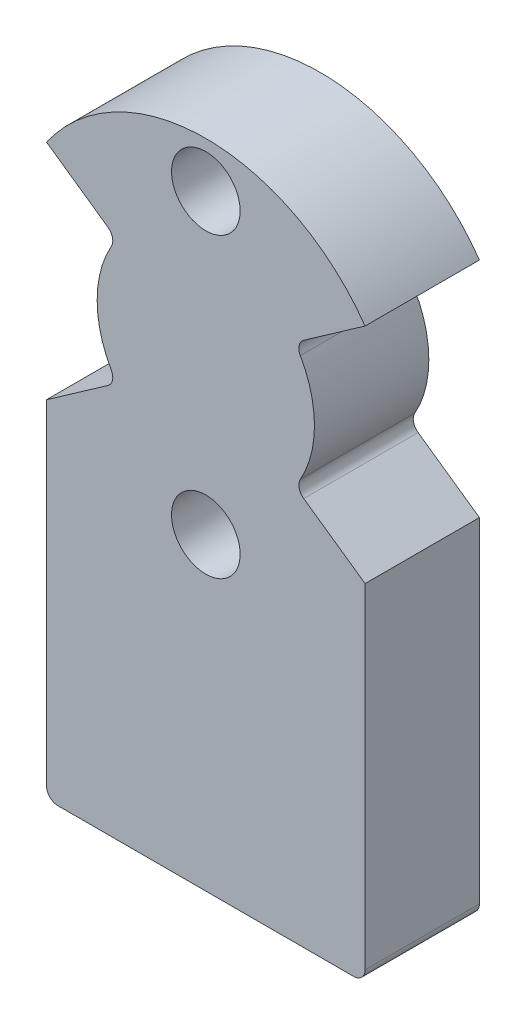
ISO-10303-21;
HEADER;
FILE_DESCRIPTION(('STEP AP214'),'2;1');
FILE_NAME('part.step','',(''),(''),'','','');
FILE_SCHEMA(('AUTOMOTIVE_DESIGN { 1 0 10303 214 1 1 1 1 }'));
ENDSEC;
DATA;
#1=APPLICATION_CONTEXT('core data for automotive mechanical design processes');
#2=APPLICATION_PROTOCOL_DEFINITION('international standard','automotive_design',2000,#1);
#3=PRODUCT_CONTEXT('',#1,'mechanical');
#4=PRODUCT('Part','Part','',(#3));
#5=PRODUCT_RELATED_PRODUCT_CATEGORY('part','',(#4));
#6=PRODUCT_DEFINITION_FORMATION('','',#4);
#7=PRODUCT_DEFINITION_CONTEXT('part definition',#1,'design');
#8=PRODUCT_DEFINITION('design','',#6,#7);
#9=PRODUCT_DEFINITION_SHAPE('','',#8);
#10=(LENGTH_UNIT() NAMED_UNIT(*) SI_UNIT(.MILLI.,.METRE.));
#11=(NAMED_UNIT(*) PLANE_ANGLE_UNIT() SI_UNIT($,.RADIAN.));
#12=(NAMED_UNIT(*) SI_UNIT($,.STERADIAN.) SOLID_ANGLE_UNIT());
#13=UNCERTAINTY_MEASURE_WITH_UNIT(LENGTH_MEASURE(1.E-05),#10,'distance_accuracy_value','');
#14=(GEOMETRIC_REPRESENTATION_CONTEXT(3) GLOBAL_UNCERTAINTY_ASSIGNED_CONTEXT((#13)) GLOBAL_UNIT_ASSIGNED_CONTEXT((#10,
#11,#12)) REPRESENTATION_CONTEXT('',''));
#15=CARTESIAN_POINT('',(0.,0.,0.));
#16=DIRECTION('',(0.,0.,1.));
#17=DIRECTION('',(1.,0.,0.));
#18=AXIS2_PLACEMENT_3D('',#15,#16,#17);
#19=CARTESIAN_POINT('',(0.,0.,5.));
#20=DIRECTION('',(0.,0.,1.));
#21=DIRECTION('',(1.,0.,0.));
#22=AXIS2_PLACEMENT_3D('',#19,#20,#21);
#23=PLANE('',#22);
#24=CARTESIAN_POINT('',(0.,6.5,5.));
#25=DIRECTION('',(0.,0.,1.));
#26=DIRECTION('',(1.,0.,0.));
#27=AXIS2_PLACEMENT_3D('',#24,#25,#26);
#28=CIRCLE('',#27,1.5);
#29=CARTESIAN_POINT('',(1.5,6.5,5.));
#30=VERTEX_POINT('',#29);
#31=EDGE_CURVE('E226',#30,#30,#28,.T.);
#32=ORIENTED_EDGE('',*,*,#31,.F.);
#33=EDGE_LOOP('',(#32));
#34=FACE_BOUND('',#33,.T.);
#35=CARTESIAN_POINT('',(0.,-6.5,5.));
#36=DIRECTION('',(0.,0.,1.));
#37=DIRECTION('',(1.,0.,0.));
#38=AXIS2_PLACEMENT_3D('',#35,#36,#37);
#39=CIRCLE('',#38,1.5);
#40=CARTESIAN_POINT('',(1.5,-6.5,5.));
#41=VERTEX_POINT('',#40);
#42=EDGE_CURVE('E221',#41,#41,#39,.T.);
#43=ORIENTED_EDGE('',*,*,#42,.F.);
#44=EDGE_LOOP('',(#43));
#45=FACE_BOUND('',#44,.T.);
#46=DIRECTION('',(-1.,0.,0.));
#47=VECTOR('',#46,1.);
#48=CARTESIAN_POINT('',(0.,-20.,5.));
#49=LINE('',#48,#47);
#50=CARTESIAN_POINT('',(6.46279237645642,-20.,5.));
#51=VERTEX_POINT('',#50);
#52=CARTESIAN_POINT('',(-6.46279237645642,-20.,5.));
#53=VERTEX_POINT('',#52);
#54=EDGE_CURVE('E192',#51,#53,#49,.T.);
#55=ORIENTED_EDGE('',*,*,#54,.F.);
#56=CARTESIAN_POINT('',(6.46279237645642,-19.5,5.));
#57=DIRECTION('',(0.,0.,1.));
#58=DIRECTION('',(1.,0.,0.));
#59=AXIS2_PLACEMENT_3D('',#56,#57,#58);
#60=CIRCLE('',#59,0.5);
#61=CARTESIAN_POINT('',(6.96279237645642,-19.5,5.));
#62=VERTEX_POINT('',#61);
#63=EDGE_CURVE('E48',#51,#62,#60,.T.);
#64=ORIENTED_EDGE('',*,*,#63,.T.);
#65=DIRECTION('',(0.,-1.,0.));
#66=VECTOR('',#65,1.);
#67=CARTESIAN_POINT('',(6.96279237645642,0.,5.));
#68=LINE('',#67,#66);
#69=CARTESIAN_POINT('',(6.96279237645642,-4.8753997089839,5.));
#70=VERTEX_POINT('',#69);
#71=EDGE_CURVE('E285',#70,#62,#68,.T.);
#72=ORIENTED_EDGE('',*,*,#71,.F.);
#73=DIRECTION('',(0.819152044288991,-0.573576436351047,0.));
#74=VECTOR('',#73,1.);
#75=CARTESIAN_POINT('',(0.,0.,5.));
#76=LINE('',#75,#74);
#77=CARTESIAN_POINT('',(4.28100018480391,-2.99758860047687,5.));
#78=VERTEX_POINT('',#77);
#79=EDGE_CURVE('E170',#78,#70,#76,.T.);
#80=ORIENTED_EDGE('',*,*,#79,.F.);
#81=CARTESIAN_POINT('',(4.56778840297943,-2.58801257833237,5.));
#82=DIRECTION('',(0.,0.,1.));
#83=DIRECTION('',(1.,0.,0.));
#84=AXIS2_PLACEMENT_3D('',#81,#82,#83);
#85=CIRCLE('',#84,0.5);
#86=CARTESIAN_POINT('',(4.13276093602901,-2.34153518991977,5.));
#87=VERTEX_POINT('',#86);
#88=EDGE_CURVE('E272',#78,#87,#85,.F.);
#89=ORIENTED_EDGE('',*,*,#88,.T.);
#90=CARTESIAN_POINT('',(0.,0.,5.));
#91=DIRECTION('',(0.,0.,1.));
#92=DIRECTION('',(1.,0.,0.));
#93=AXIS2_PLACEMENT_3D('',#90,#91,#92);
#94=CIRCLE('',#93,4.75);
#95=CARTESIAN_POINT('',(4.13276093602901,2.34153518991977,5.));
#96=VERTEX_POINT('',#95);
#97=EDGE_CURVE('E163',#87,#96,#94,.T.);
#98=ORIENTED_EDGE('',*,*,#97,.T.);
#99=CARTESIAN_POINT('',(4.56778840297943,2.58801257833237,5.));
#100=DIRECTION('',(0.,0.,1.));
#101=DIRECTION('',(1.,0.,0.));
#102=AXIS2_PLACEMENT_3D('',#99,#100,#101);
#103=CIRCLE('',#102,0.5);
#104=CARTESIAN_POINT('',(4.28100018480391,2.99758860047687,5.));
#105=VERTEX_POINT('',#104);
#106=EDGE_CURVE('E269',#96,#105,#103,.F.);
#107=ORIENTED_EDGE('',*,*,#106,.T.);
#108=DIRECTION('',(0.819152044288991,0.573576436351047,0.));
#109=VECTOR('',#108,1.);
#110=CARTESIAN_POINT('',(0.,0.,5.));
#111=LINE('',#110,#109);
#112=CARTESIAN_POINT('',(6.96279237645642,4.8753997089839,5.));
#113=VERTEX_POINT('',#112);
#114=EDGE_CURVE('E195',#105,#113,#111,.T.);
#115=ORIENTED_EDGE('',*,*,#114,.T.);
#116=CARTESIAN_POINT('',(0.,0.,5.));
#117=DIRECTION('',(0.,0.,1.));
#118=DIRECTION('',(1.,0.,0.));
#119=AXIS2_PLACEMENT_3D('',#116,#117,#118);
#120=CIRCLE('',#119,8.5);
#121=CARTESIAN_POINT('',(-6.96279237645642,4.8753997089839,5.));
#122=VERTEX_POINT('',#121);
#123=EDGE_CURVE('E234',#113,#122,#120,.T.);
#124=ORIENTED_EDGE('',*,*,#123,.T.);
#125=DIRECTION('',(-0.819152044288991,0.573576436351047,0.));
#126=VECTOR('',#125,1.);
#127=CARTESIAN_POINT('',(0.,0.,5.));
#128=LINE('',#127,#126);
#129=CARTESIAN_POINT('',(-4.28100018480391,2.99758860047687,5.));
#130=VERTEX_POINT('',#129);
#131=EDGE_CURVE('E211',#130,#122,#128,.T.);
#132=ORIENTED_EDGE('',*,*,#131,.F.);
#133=CARTESIAN_POINT('',(-4.56778840297943,2.58801257833237,5.));
#134=DIRECTION('',(0.,0.,1.));
#135=DIRECTION('',(1.,0.,0.));
#136=AXIS2_PLACEMENT_3D('',#133,#134,#135);
#137=CIRCLE('',#136,0.5);
#138=CARTESIAN_POINT('',(-4.13276093602901,2.34153518991977,5.));
#139=VERTEX_POINT('',#138);
#140=EDGE_CURVE('E265',#130,#139,#137,.F.);
#141=ORIENTED_EDGE('',*,*,#140,.T.);
#142=CARTESIAN_POINT('',(0.,0.,5.));
#143=DIRECTION('',(0.,0.,-1.));
#144=DIRECTION('',(-1.,0.,0.));
#145=AXIS2_PLACEMENT_3D('',#142,#143,#144);
#146=CIRCLE('',#145,4.75);
#147=CARTESIAN_POINT('',(-4.13276093602901,-2.34153518991977,5.));
#148=VERTEX_POINT('',#147);
#149=EDGE_CURVE('E205',#148,#139,#146,.T.);
#150=ORIENTED_EDGE('',*,*,#149,.F.);
#151=CARTESIAN_POINT('',(-4.56778840297943,-2.58801257833237,5.));
#152=DIRECTION('',(0.,0.,1.));
#153=DIRECTION('',(1.,0.,0.));
#154=AXIS2_PLACEMENT_3D('',#151,#152,#153);
#155=CIRCLE('',#154,0.5);
#156=CARTESIAN_POINT('',(-4.28100018480391,-2.99758860047687,5.));
#157=VERTEX_POINT('',#156);
#158=EDGE_CURVE('E261',#148,#157,#155,.F.);
#159=ORIENTED_EDGE('',*,*,#158,.T.);
#160=DIRECTION('',(-0.819152044288991,-0.573576436351047,0.));
#161=VECTOR('',#160,1.);
#162=CARTESIAN_POINT('',(0.,0.,5.));
#163=LINE('',#162,#161);
#164=CARTESIAN_POINT('',(-6.96279237645642,-4.8753997089839,5.));
#165=VERTEX_POINT('',#164);
#166=EDGE_CURVE('E208',#157,#165,#163,.T.);
#167=ORIENTED_EDGE('',*,*,#166,.T.);
#168=DIRECTION('',(0.,-1.,0.));
#169=VECTOR('',#168,1.);
#170=CARTESIAN_POINT('',(-6.96279237645642,0.,5.));
#171=LINE('',#170,#169);
#172=CARTESIAN_POINT('',(-6.96279237645642,-19.5,5.));
#173=VERTEX_POINT('',#172);
#174=EDGE_CURVE('E185',#165,#173,#171,.T.);
#175=ORIENTED_EDGE('',*,*,#174,.T.);
#176=CARTESIAN_POINT('',(-6.46279237645642,-19.5,5.));
#177=DIRECTION('',(0.,0.,1.));
#178=DIRECTION('',(1.,0.,0.));
#179=AXIS2_PLACEMENT_3D('',#176,#177,#178);
#180=CIRCLE('',#179,0.5);
#181=EDGE_CURVE('E60',#173,#53,#180,.T.);
#182=ORIENTED_EDGE('',*,*,#181,.T.);
#183=EDGE_LOOP('',(#55,#64,#72,#80,#89,#98,#107,#115,#124,#132,#141,#150,#159,#167,#175,#182));
#184=FACE_BOUND('',#183,.T.);
#185=ADVANCED_FACE('F40',(#34,#45,#184),#23,.T.);
#186=CARTESIAN_POINT('',(0.,0.,0.));
#187=DIRECTION('',(0.,0.,1.));
#188=DIRECTION('',(1.,0.,0.));
#189=AXIS2_PLACEMENT_3D('',#186,#187,#188);
#190=PLANE('',#189);
#191=CARTESIAN_POINT('',(0.,6.5,0.));
#192=DIRECTION('',(0.,0.,1.));
#193=DIRECTION('',(1.,0.,0.));
#194=AXIS2_PLACEMENT_3D('',#191,#192,#193);
#195=CIRCLE('',#194,1.5);
#196=CARTESIAN_POINT('',(1.5,6.5,0.));
#197=VERTEX_POINT('',#196);
#198=EDGE_CURVE('E222',#197,#197,#195,.T.);
#199=ORIENTED_EDGE('',*,*,#198,.T.);
#200=EDGE_LOOP('',(#199));
#201=FACE_BOUND('',#200,.T.);
#202=CARTESIAN_POINT('',(0.,-6.5,0.));
#203=DIRECTION('',(0.,0.,1.));
#204=DIRECTION('',(1.,0.,0.));
#205=AXIS2_PLACEMENT_3D('',#202,#203,#204);
#206=CIRCLE('',#205,1.5);
#207=CARTESIAN_POINT('',(1.5,-6.5,0.));
#208=VERTEX_POINT('',#207);
#209=EDGE_CURVE('E229',#208,#208,#206,.T.);
#210=ORIENTED_EDGE('',*,*,#209,.T.);
#211=EDGE_LOOP('',(#210));
#212=FACE_BOUND('',#211,.T.);
#213=DIRECTION('',(0.,-1.,0.));
#214=VECTOR('',#213,1.);
#215=CARTESIAN_POINT('',(6.96279237645642,0.,0.));
#216=LINE('',#215,#214);
#217=CARTESIAN_POINT('',(6.96279237645643,-4.8753997089839,0.));
#218=VERTEX_POINT('',#217);
#219=CARTESIAN_POINT('',(6.96279237645642,-19.5,0.));
#220=VERTEX_POINT('',#219);
#221=EDGE_CURVE('E158',#218,#220,#216,.T.);
#222=ORIENTED_EDGE('',*,*,#221,.T.);
#223=CARTESIAN_POINT('',(6.46279237645642,-19.5,0.));
#224=DIRECTION('',(0.,0.,1.));
#225=DIRECTION('',(1.,0.,0.));
#226=AXIS2_PLACEMENT_3D('',#223,#224,#225);
#227=CIRCLE('',#226,0.5);
#228=CARTESIAN_POINT('',(6.46279237645642,-20.,0.));
#229=VERTEX_POINT('',#228);
#230=EDGE_CURVE('E277',#220,#229,#227,.F.);
#231=ORIENTED_EDGE('',*,*,#230,.T.);
#232=DIRECTION('',(-1.,0.,0.));
#233=VECTOR('',#232,1.);
#234=CARTESIAN_POINT('',(0.,-20.,0.));
#235=LINE('',#234,#233);
#236=CARTESIAN_POINT('',(-6.46279237645642,-20.,0.));
#237=VERTEX_POINT('',#236);
#238=EDGE_CURVE('E181',#229,#237,#235,.T.);
#239=ORIENTED_EDGE('',*,*,#238,.T.);
#240=CARTESIAN_POINT('',(-6.46279237645642,-19.5,0.));
#241=DIRECTION('',(0.,0.,1.));
#242=DIRECTION('',(1.,0.,0.));
#243=AXIS2_PLACEMENT_3D('',#240,#241,#242);
#244=CIRCLE('',#243,0.5);
#245=CARTESIAN_POINT('',(-6.96279237645642,-19.5,0.));
#246=VERTEX_POINT('',#245);
#247=EDGE_CURVE('E275',#237,#246,#244,.F.);
#248=ORIENTED_EDGE('',*,*,#247,.T.);
#249=DIRECTION('',(0.,-1.,0.));
#250=VECTOR('',#249,1.);
#251=CARTESIAN_POINT('',(-6.96279237645642,0.,0.));
#252=LINE('',#251,#250);
#253=CARTESIAN_POINT('',(-6.96279237645642,-4.8753997089839,0.));
#254=VERTEX_POINT('',#253);
#255=EDGE_CURVE('E182',#254,#246,#252,.T.);
#256=ORIENTED_EDGE('',*,*,#255,.F.);
#257=DIRECTION('',(-0.819152044288991,-0.573576436351047,0.));
#258=VECTOR('',#257,1.);
#259=CARTESIAN_POINT('',(0.,0.,0.));
#260=LINE('',#259,#258);
#261=CARTESIAN_POINT('',(-4.28100018480391,-2.99758860047687,0.));
#262=VERTEX_POINT('',#261);
#263=EDGE_CURVE('E216',#262,#254,#260,.T.);
#264=ORIENTED_EDGE('',*,*,#263,.F.);
#265=CARTESIAN_POINT('',(-4.56778840297943,-2.58801257833237,0.));
#266=DIRECTION('',(0.,0.,1.));
#267=DIRECTION('',(1.,0.,0.));
#268=AXIS2_PLACEMENT_3D('',#265,#266,#267);
#269=CIRCLE('',#268,0.5);
#270=CARTESIAN_POINT('',(-4.13276093602901,-2.34153518991977,0.));
#271=VERTEX_POINT('',#270);
#272=EDGE_CURVE('E259',#262,#271,#269,.T.);
#273=ORIENTED_EDGE('',*,*,#272,.T.);
#274=CARTESIAN_POINT('',(0.,0.,0.));
#275=DIRECTION('',(0.,0.,-1.));
#276=DIRECTION('',(-1.,0.,0.));
#277=AXIS2_PLACEMENT_3D('',#274,#275,#276);
#278=CIRCLE('',#277,4.75);
#279=CARTESIAN_POINT('',(-4.13276093602901,2.34153518991977,0.));
#280=VERTEX_POINT('',#279);
#281=EDGE_CURVE('E204',#271,#280,#278,.T.);
#282=ORIENTED_EDGE('',*,*,#281,.T.);
#283=CARTESIAN_POINT('',(-4.56778840297943,2.58801257833237,0.));
#284=DIRECTION('',(0.,0.,1.));
#285=DIRECTION('',(1.,0.,0.));
#286=AXIS2_PLACEMENT_3D('',#283,#284,#285);
#287=CIRCLE('',#286,0.5);
#288=CARTESIAN_POINT('',(-4.28100018480391,2.99758860047687,0.));
#289=VERTEX_POINT('',#288);
#290=EDGE_CURVE('E263',#280,#289,#287,.T.);
#291=ORIENTED_EDGE('',*,*,#290,.T.);
#292=DIRECTION('',(-0.819152044288991,0.573576436351047,0.));
#293=VECTOR('',#292,1.);
#294=CARTESIAN_POINT('',(0.,0.,0.));
#295=LINE('',#294,#293);
#296=CARTESIAN_POINT('',(-6.96279237645642,4.8753997089839,0.));
#297=VERTEX_POINT('',#296);
#298=EDGE_CURVE('E209',#289,#297,#295,.T.);
#299=ORIENTED_EDGE('',*,*,#298,.T.);
#300=CARTESIAN_POINT('',(0.,0.,0.));
#301=DIRECTION('',(0.,0.,1.));
#302=DIRECTION('',(1.,0.,0.));
#303=AXIS2_PLACEMENT_3D('',#300,#301,#302);
#304=CIRCLE('',#303,8.5);
#305=CARTESIAN_POINT('',(6.96279237645642,4.8753997089839,0.));
#306=VERTEX_POINT('',#305);
#307=EDGE_CURVE('E225',#306,#297,#304,.T.);
#308=ORIENTED_EDGE('',*,*,#307,.F.);
#309=DIRECTION('',(0.819152044288991,0.573576436351047,0.));
#310=VECTOR('',#309,1.);
#311=CARTESIAN_POINT('',(0.,0.,0.));
#312=LINE('',#311,#310);
#313=CARTESIAN_POINT('',(4.28100018480391,2.99758860047687,0.));
#314=VERTEX_POINT('',#313);
#315=EDGE_CURVE('E164',#314,#306,#312,.T.);
#316=ORIENTED_EDGE('',*,*,#315,.F.);
#317=CARTESIAN_POINT('',(4.56778840297943,2.58801257833237,0.));
#318=DIRECTION('',(0.,0.,1.));
#319=DIRECTION('',(1.,0.,0.));
#320=AXIS2_PLACEMENT_3D('',#317,#318,#319);
#321=CIRCLE('',#320,0.5);
#322=CARTESIAN_POINT('',(4.13276093602901,2.34153518991977,0.));
#323=VERTEX_POINT('',#322);
#324=EDGE_CURVE('E267',#314,#323,#321,.T.);
#325=ORIENTED_EDGE('',*,*,#324,.T.);
#326=CARTESIAN_POINT('',(0.,0.,0.));
#327=DIRECTION('',(0.,0.,1.));
#328=DIRECTION('',(1.,0.,0.));
#329=AXIS2_PLACEMENT_3D('',#326,#327,#328);
#330=CIRCLE('',#329,4.75);
#331=CARTESIAN_POINT('',(4.13276093602901,-2.34153518991977,0.));
#332=VERTEX_POINT('',#331);
#333=EDGE_CURVE('E174',#332,#323,#330,.T.);
#334=ORIENTED_EDGE('',*,*,#333,.F.);
#335=CARTESIAN_POINT('',(4.56778840297943,-2.58801257833237,0.));
#336=DIRECTION('',(0.,0.,1.));
#337=DIRECTION('',(1.,0.,0.));
#338=AXIS2_PLACEMENT_3D('',#335,#336,#337);
#339=CIRCLE('',#338,0.5);
#340=CARTESIAN_POINT('',(4.28100018480391,-2.99758860047687,0.));
#341=VERTEX_POINT('',#340);
#342=EDGE_CURVE('E160',#332,#341,#339,.T.);
#343=ORIENTED_EDGE('',*,*,#342,.T.);
#344=DIRECTION('',(0.819152044288991,-0.573576436351047,0.));
#345=VECTOR('',#344,1.);
#346=CARTESIAN_POINT('',(0.,0.,0.));
#347=LINE('',#346,#345);
#348=EDGE_CURVE('E154',#341,#218,#347,.T.);
#349=ORIENTED_EDGE('',*,*,#348,.T.);
#350=EDGE_LOOP('',(#222,#231,#239,#248,#256,#264,#273,#282,#291,#299,#308,#316,#325,#334,#343,#349));
#351=FACE_BOUND('',#350,.T.);
#352=ADVANCED_FACE('F156',(#201,#212,#351),#190,.F.);
#353=CARTESIAN_POINT('',(0.,0.,5.));
#354=DIRECTION('',(0.,0.,-1.));
#355=DIRECTION('',(-1.,0.,0.));
#356=AXIS2_PLACEMENT_3D('',#353,#354,#355);
#357=CYLINDRICAL_SURFACE('',#356,8.5);
#358=ORIENTED_EDGE('',*,*,#123,.F.);
#359=DIRECTION('',(0.,0.,-1.));
#360=VECTOR('',#359,1.);
#361=CARTESIAN_POINT('',(6.96279237645642,4.8753997089839,5.));
#362=LINE('',#361,#360);
#363=EDGE_CURVE('E198',#113,#306,#362,.T.);
#364=ORIENTED_EDGE('',*,*,#363,.T.);
#365=ORIENTED_EDGE('',*,*,#307,.T.);
#366=DIRECTION('',(0.,0.,-1.));
#367=VECTOR('',#366,1.);
#368=CARTESIAN_POINT('',(-6.96279237645642,4.8753997089839,5.));
#369=LINE('',#368,#367);
#370=EDGE_CURVE('E213',#122,#297,#369,.T.);
#371=ORIENTED_EDGE('',*,*,#370,.F.);
#372=EDGE_LOOP('',(#358,#364,#365,#371));
#373=FACE_BOUND('',#372,.T.);
#374=ADVANCED_FACE('F324',(#373),#357,.T.);
#375=CARTESIAN_POINT('',(0.,-6.5,0.));
#376=DIRECTION('',(0.,0.,1.));
#377=DIRECTION('',(1.,0.,0.));
#378=AXIS2_PLACEMENT_3D('',#375,#376,#377);
#379=CYLINDRICAL_SURFACE('',#378,1.5);
#380=ORIENTED_EDGE('',*,*,#209,.F.);
#381=EDGE_LOOP('',(#380));
#382=FACE_BOUND('',#381,.T.);
#383=ORIENTED_EDGE('',*,*,#42,.T.);
#384=EDGE_LOOP('',(#383));
#385=FACE_BOUND('',#384,.T.);
#386=ADVANCED_FACE('F360',(#382,#385),#379,.F.);
#387=CARTESIAN_POINT('',(0.,6.5,0.));
#388=DIRECTION('',(0.,0.,1.));
#389=DIRECTION('',(1.,0.,0.));
#390=AXIS2_PLACEMENT_3D('',#387,#388,#389);
#391=CYLINDRICAL_SURFACE('',#390,1.5);
#392=ORIENTED_EDGE('',*,*,#198,.F.);
#393=EDGE_LOOP('',(#392));
#394=FACE_BOUND('',#393,.T.);
#395=ORIENTED_EDGE('',*,*,#31,.T.);
#396=EDGE_LOOP('',(#395));
#397=FACE_BOUND('',#396,.T.);
#398=ADVANCED_FACE('F496',(#394,#397),#391,.F.);
#399=CARTESIAN_POINT('',(0.,0.,5.));
#400=DIRECTION('',(0.,0.,-1.));
#401=DIRECTION('',(-1.,0.,0.));
#402=AXIS2_PLACEMENT_3D('',#399,#400,#401);
#403=CYLINDRICAL_SURFACE('',#402,4.75);
#404=ORIENTED_EDGE('',*,*,#281,.F.);
#405=DIRECTION('',(0.,0.,-1.));
#406=VECTOR('',#405,1.);
#407=CARTESIAN_POINT('',(-4.13276093602901,-2.34153518991977,5.));
#408=LINE('',#407,#406);
#409=EDGE_CURVE('E245',#271,#148,#408,.F.);
#410=ORIENTED_EDGE('',*,*,#409,.T.);
#411=ORIENTED_EDGE('',*,*,#149,.T.);
#412=DIRECTION('',(0.,0.,-1.));
#413=VECTOR('',#412,1.);
#414=CARTESIAN_POINT('',(-4.13276093602901,2.34153518991977,5.));
#415=LINE('',#414,#413);
#416=EDGE_CURVE('E242',#139,#280,#415,.T.);
#417=ORIENTED_EDGE('',*,*,#416,.T.);
#418=EDGE_LOOP('',(#404,#410,#411,#417));
#419=FACE_BOUND('',#418,.T.);
#420=ADVANCED_FACE('F307',(#419),#403,.T.);
#421=CARTESIAN_POINT('',(0.,0.,5.));
#422=DIRECTION('',(-0.573576436351047,-0.819152044288991,0.));
#423=DIRECTION('',(0.819152044288991,-0.573576436351047,0.));
#424=AXIS2_PLACEMENT_3D('',#421,#422,#423);
#425=PLANE('',#424);
#426=ORIENTED_EDGE('',*,*,#298,.F.);
#427=DIRECTION('',(0.,0.,1.));
#428=VECTOR('',#427,1.);
#429=CARTESIAN_POINT('',(-4.28100018480391,2.99758860047687,5.));
#430=LINE('',#429,#428);
#431=EDGE_CURVE('E247',#289,#130,#430,.T.);
#432=ORIENTED_EDGE('',*,*,#431,.T.);
#433=ORIENTED_EDGE('',*,*,#131,.T.);
#434=ORIENTED_EDGE('',*,*,#370,.T.);
#435=EDGE_LOOP('',(#426,#432,#433,#434));
#436=FACE_BOUND('',#435,.T.);
#437=ADVANCED_FACE('F320',(#436),#425,.T.);
#438=CARTESIAN_POINT('',(0.,0.,5.));
#439=DIRECTION('',(0.573576436351047,-0.819152044288991,0.));
#440=DIRECTION('',(0.819152044288991,0.573576436351047,0.));
#441=AXIS2_PLACEMENT_3D('',#438,#439,#440);
#442=PLANE('',#441);
#443=ORIENTED_EDGE('',*,*,#166,.F.);
#444=DIRECTION('',(0.,0.,-1.));
#445=VECTOR('',#444,1.);
#446=CARTESIAN_POINT('',(-4.28100018480391,-2.99758860047687,5.));
#447=LINE('',#446,#445);
#448=EDGE_CURVE('E237',#157,#262,#447,.T.);
#449=ORIENTED_EDGE('',*,*,#448,.T.);
#450=ORIENTED_EDGE('',*,*,#263,.T.);
#451=DIRECTION('',(0.,0.,-1.));
#452=VECTOR('',#451,1.);
#453=CARTESIAN_POINT('',(-6.96279237645642,-4.8753997089839,5.));
#454=LINE('',#453,#452);
#455=EDGE_CURVE('E175',#165,#254,#454,.T.);
#456=ORIENTED_EDGE('',*,*,#455,.F.);
#457=EDGE_LOOP('',(#443,#449,#450,#456));
#458=FACE_BOUND('',#457,.T.);
#459=ADVANCED_FACE('F301',(#458),#442,.F.);
#460=CARTESIAN_POINT('',(0.,0.,5.));
#461=DIRECTION('',(0.,0.,-1.));
#462=DIRECTION('',(-1.,0.,0.));
#463=AXIS2_PLACEMENT_3D('',#460,#461,#462);
#464=CYLINDRICAL_SURFACE('',#463,4.75);
#465=ORIENTED_EDGE('',*,*,#333,.T.);
#466=DIRECTION('',(0.,0.,-1.));
#467=VECTOR('',#466,1.);
#468=CARTESIAN_POINT('',(4.13276093602901,2.34153518991977,5.));
#469=LINE('',#468,#467);
#470=EDGE_CURVE('E255',#323,#96,#469,.F.);
#471=ORIENTED_EDGE('',*,*,#470,.T.);
#472=ORIENTED_EDGE('',*,*,#97,.F.);
#473=DIRECTION('',(0.,0.,-1.));
#474=VECTOR('',#473,1.);
#475=CARTESIAN_POINT('',(4.13276093602901,-2.34153518991977,5.));
#476=LINE('',#475,#474);
#477=EDGE_CURVE('E252',#87,#332,#476,.T.);
#478=ORIENTED_EDGE('',*,*,#477,.T.);
#479=EDGE_LOOP('',(#465,#471,#472,#478));
#480=FACE_BOUND('',#479,.T.);
#481=ADVANCED_FACE('F337',(#480),#464,.T.);
#482=CARTESIAN_POINT('',(0.,0.,5.));
#483=DIRECTION('',(0.573576436351047,0.819152044288991,0.));
#484=DIRECTION('',(-0.819152044288991,0.573576436351047,0.));
#485=AXIS2_PLACEMENT_3D('',#482,#483,#484);
#486=PLANE('',#485);
#487=ORIENTED_EDGE('',*,*,#348,.F.);
#488=DIRECTION('',(0.,0.,-1.));
#489=VECTOR('',#488,1.);
#490=CARTESIAN_POINT('',(4.28100018480391,-2.99758860047687,5.));
#491=LINE('',#490,#489);
#492=EDGE_CURVE('E257',#341,#78,#491,.F.);
#493=ORIENTED_EDGE('',*,*,#492,.T.);
#494=ORIENTED_EDGE('',*,*,#79,.T.);
#495=DIRECTION('',(0.,0.,-1.));
#496=VECTOR('',#495,1.);
#497=CARTESIAN_POINT('',(6.96279237645643,-4.8753997089839,5.));
#498=LINE('',#497,#496);
#499=EDGE_CURVE('E167',#70,#218,#498,.T.);
#500=ORIENTED_EDGE('',*,*,#499,.T.);
#501=EDGE_LOOP('',(#487,#493,#494,#500));
#502=FACE_BOUND('',#501,.T.);
#503=ADVANCED_FACE('F168',(#502),#486,.T.);
#504=CARTESIAN_POINT('',(0.,0.,5.));
#505=DIRECTION('',(-0.573576436351047,0.819152044288991,0.));
#506=DIRECTION('',(-0.819152044288991,-0.573576436351047,0.));
#507=AXIS2_PLACEMENT_3D('',#504,#505,#506);
#508=PLANE('',#507);
#509=ORIENTED_EDGE('',*,*,#114,.F.);
#510=DIRECTION('',(0.,0.,1.));
#511=VECTOR('',#510,1.);
#512=CARTESIAN_POINT('',(4.28100018480391,2.99758860047687,0.));
#513=LINE('',#512,#511);
#514=EDGE_CURVE('E249',#105,#314,#513,.F.);
#515=ORIENTED_EDGE('',*,*,#514,.T.);
#516=ORIENTED_EDGE('',*,*,#315,.T.);
#517=ORIENTED_EDGE('',*,*,#363,.F.);
#518=EDGE_LOOP('',(#509,#515,#516,#517));
#519=FACE_BOUND('',#518,.T.);
#520=ADVANCED_FACE('F329',(#519),#508,.F.);
#521=CARTESIAN_POINT('',(-6.96279237645642,0.,5.));
#522=DIRECTION('',(1.,0.,0.));
#523=DIRECTION('',(0.,0.,-1.));
#524=AXIS2_PLACEMENT_3D('',#521,#522,#523);
#525=PLANE('',#524);
#526=ORIENTED_EDGE('',*,*,#255,.T.);
#527=DIRECTION('',(0.,0.,-1.));
#528=VECTOR('',#527,1.);
#529=CARTESIAN_POINT('',(-6.96279237645642,-19.5,5.));
#530=LINE('',#529,#528);
#531=EDGE_CURVE('E11',#246,#173,#530,.F.);
#532=ORIENTED_EDGE('',*,*,#531,.T.);
#533=ORIENTED_EDGE('',*,*,#174,.F.);
#534=ORIENTED_EDGE('',*,*,#455,.T.);
#535=EDGE_LOOP('',(#526,#532,#533,#534));
#536=FACE_BOUND('',#535,.T.);
#537=ADVANCED_FACE('F297',(#536),#525,.F.);
#538=CARTESIAN_POINT('',(0.,-20.,5.));
#539=DIRECTION('',(0.,-1.,0.));
#540=DIRECTION('',(0.,0.,-1.));
#541=AXIS2_PLACEMENT_3D('',#538,#539,#540);
#542=PLANE('',#541);
#543=ORIENTED_EDGE('',*,*,#238,.F.);
#544=DIRECTION('',(0.,0.,-1.));
#545=VECTOR('',#544,1.);
#546=CARTESIAN_POINT('',(6.46279237645642,-20.,5.));
#547=LINE('',#546,#545);
#548=EDGE_CURVE('E282',#229,#51,#547,.F.);
#549=ORIENTED_EDGE('',*,*,#548,.T.);
#550=ORIENTED_EDGE('',*,*,#54,.T.);
#551=DIRECTION('',(0.,0.,-1.));
#552=VECTOR('',#551,1.);
#553=CARTESIAN_POINT('',(-6.46279237645642,-20.,0.));
#554=LINE('',#553,#552);
#555=EDGE_CURVE('E279',#53,#237,#554,.T.);
#556=ORIENTED_EDGE('',*,*,#555,.T.);
#557=EDGE_LOOP('',(#543,#549,#550,#556));
#558=FACE_BOUND('',#557,.T.);
#559=ADVANCED_FACE('F292',(#558),#542,.T.);
#560=CARTESIAN_POINT('',(6.96279237645642,0.,5.));
#561=DIRECTION('',(1.,0.,0.));
#562=DIRECTION('',(0.,0.,-1.));
#563=AXIS2_PLACEMENT_3D('',#560,#561,#562);
#564=PLANE('',#563);
#565=ORIENTED_EDGE('',*,*,#71,.T.);
#566=DIRECTION('',(0.,0.,-1.));
#567=VECTOR('',#566,1.);
#568=CARTESIAN_POINT('',(6.96279237645642,-19.5,5.));
#569=LINE('',#568,#567);
#570=EDGE_CURVE('E180',#62,#220,#569,.T.);
#571=ORIENTED_EDGE('',*,*,#570,.T.);
#572=ORIENTED_EDGE('',*,*,#221,.F.);
#573=ORIENTED_EDGE('',*,*,#499,.F.);
#574=EDGE_LOOP('',(#565,#571,#572,#573));
#575=FACE_BOUND('',#574,.T.);
#576=ADVANCED_FACE('F178',(#575),#564,.T.);
#577=CARTESIAN_POINT('',(-4.56778840297943,-2.58801257833237,5.));
#578=DIRECTION('',(0.,0.,-1.));
#579=DIRECTION('',(-1.,0.,0.));
#580=AXIS2_PLACEMENT_3D('',#577,#578,#579);
#581=CYLINDRICAL_SURFACE('',#580,0.5);
#582=ORIENTED_EDGE('',*,*,#158,.F.);
#583=ORIENTED_EDGE('',*,*,#409,.F.);
#584=ORIENTED_EDGE('',*,*,#272,.F.);
#585=ORIENTED_EDGE('',*,*,#448,.F.);
#586=EDGE_LOOP('',(#582,#583,#584,#585));
#587=FACE_BOUND('',#586,.T.);
#588=ADVANCED_FACE('F311',(#587),#581,.F.);
#589=CARTESIAN_POINT('',(-4.56778840297943,2.58801257833237,5.));
#590=DIRECTION('',(0.,0.,-1.));
#591=DIRECTION('',(-1.,0.,0.));
#592=AXIS2_PLACEMENT_3D('',#589,#590,#591);
#593=CYLINDRICAL_SURFACE('',#592,0.5);
#594=ORIENTED_EDGE('',*,*,#140,.F.);
#595=ORIENTED_EDGE('',*,*,#431,.F.);
#596=ORIENTED_EDGE('',*,*,#290,.F.);
#597=ORIENTED_EDGE('',*,*,#416,.F.);
#598=EDGE_LOOP('',(#594,#595,#596,#597));
#599=FACE_BOUND('',#598,.T.);
#600=ADVANCED_FACE('F315',(#599),#593,.F.);
#601=CARTESIAN_POINT('',(4.56778840297943,2.58801257833237,5.));
#602=DIRECTION('',(0.,0.,-1.));
#603=DIRECTION('',(-1.,0.,0.));
#604=AXIS2_PLACEMENT_3D('',#601,#602,#603);
#605=CYLINDRICAL_SURFACE('',#604,0.5);
#606=ORIENTED_EDGE('',*,*,#106,.F.);
#607=ORIENTED_EDGE('',*,*,#470,.F.);
#608=ORIENTED_EDGE('',*,*,#324,.F.);
#609=ORIENTED_EDGE('',*,*,#514,.F.);
#610=EDGE_LOOP('',(#606,#607,#608,#609));
#611=FACE_BOUND('',#610,.T.);
#612=ADVANCED_FACE('F333',(#611),#605,.F.);
#613=CARTESIAN_POINT('',(4.56778840297943,-2.58801257833237,5.));
#614=DIRECTION('',(0.,0.,-1.));
#615=DIRECTION('',(-1.,0.,0.));
#616=AXIS2_PLACEMENT_3D('',#613,#614,#615);
#617=CYLINDRICAL_SURFACE('',#616,0.5);
#618=ORIENTED_EDGE('',*,*,#88,.F.);
#619=ORIENTED_EDGE('',*,*,#492,.F.);
#620=ORIENTED_EDGE('',*,*,#342,.F.);
#621=ORIENTED_EDGE('',*,*,#477,.F.);
#622=EDGE_LOOP('',(#618,#619,#620,#621));
#623=FACE_BOUND('',#622,.T.);
#624=ADVANCED_FACE('F341',(#623),#617,.F.);
#625=CARTESIAN_POINT('',(6.46279237645642,-19.5,5.));
#626=DIRECTION('',(0.,0.,-1.));
#627=DIRECTION('',(-1.,0.,0.));
#628=AXIS2_PLACEMENT_3D('',#625,#626,#627);
#629=CYLINDRICAL_SURFACE('',#628,0.5);
#630=ORIENTED_EDGE('',*,*,#63,.F.);
#631=ORIENTED_EDGE('',*,*,#548,.F.);
#632=ORIENTED_EDGE('',*,*,#230,.F.);
#633=ORIENTED_EDGE('',*,*,#570,.F.);
#634=EDGE_LOOP('',(#630,#631,#632,#633));
#635=FACE_BOUND('',#634,.T.);
#636=ADVANCED_FACE('F289',(#635),#629,.T.);
#637=CARTESIAN_POINT('',(-6.46279237645642,-19.5,5.));
#638=DIRECTION('',(0.,0.,1.));
#639=DIRECTION('',(1.,0.,0.));
#640=AXIS2_PLACEMENT_3D('',#637,#638,#639);
#641=CYLINDRICAL_SURFACE('',#640,0.5);
#642=ORIENTED_EDGE('',*,*,#181,.F.);
#643=ORIENTED_EDGE('',*,*,#531,.F.);
#644=ORIENTED_EDGE('',*,*,#247,.F.);
#645=ORIENTED_EDGE('',*,*,#555,.F.);
#646=EDGE_LOOP('',(#642,#643,#644,#645));
#647=FACE_BOUND('',#646,.T.);
#648=ADVANCED_FACE('F42',(#647),#641,.T.);
#649=CLOSED_SHELL('',(#185,#352,#374,#386,#398,#420,#437,#459,#481,#503,#520,#537,#559,#576,
#588,#600,#612,#624,#636,#648));
#650=MANIFOLD_SOLID_BREP('B2',#649);
#651=ADVANCED_BREP_SHAPE_REPRESENTATION('',(#18,#650),#14);
#652=SHAPE_DEFINITION_REPRESENTATION(#9,#651);
ENDSEC;
END-ISO-10303-21;
